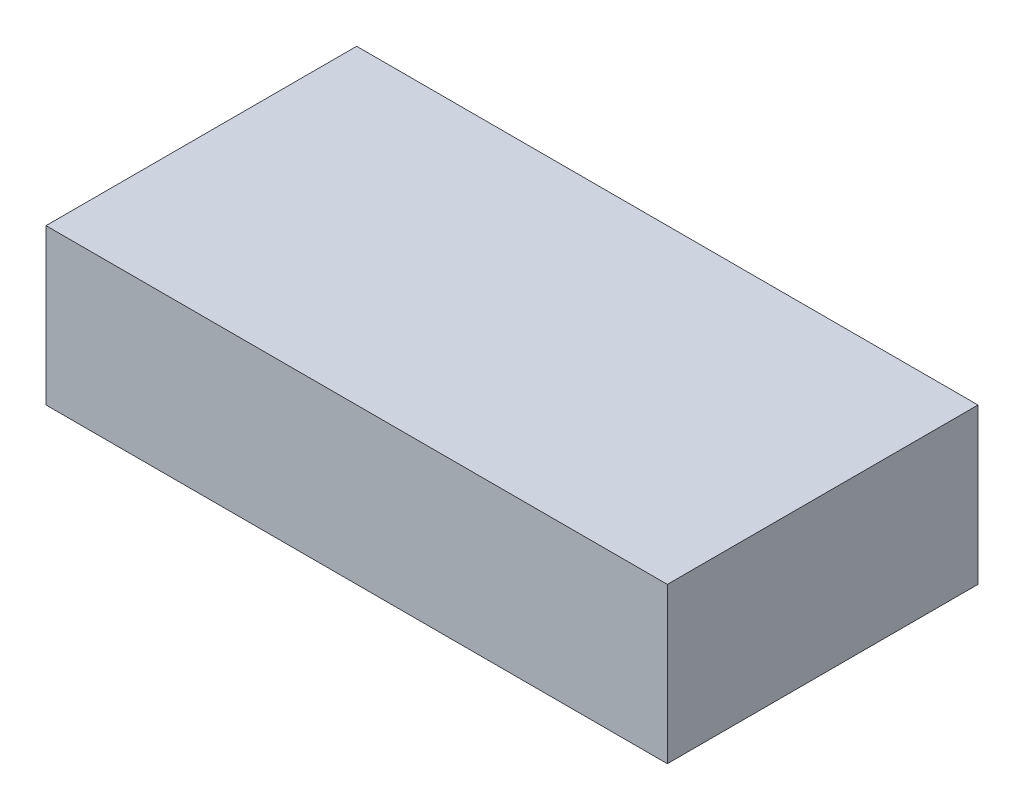
ISO-10303-21;
HEADER;
FILE_DESCRIPTION(('STEP AP214'),'2;1');
FILE_NAME('part.step','',(''),(''),'','','');
FILE_SCHEMA(('AUTOMOTIVE_DESIGN { 1 0 10303 214 1 1 1 1 }'));
ENDSEC;
DATA;
#1=APPLICATION_CONTEXT('core data for automotive mechanical design processes');
#2=APPLICATION_PROTOCOL_DEFINITION('international standard','automotive_design',2000,#1);
#3=PRODUCT_CONTEXT('',#1,'mechanical');
#4=PRODUCT('Part','Part','',(#3));
#5=PRODUCT_RELATED_PRODUCT_CATEGORY('part','',(#4));
#6=PRODUCT_DEFINITION_FORMATION('','',#4);
#7=PRODUCT_DEFINITION_CONTEXT('part definition',#1,'design');
#8=PRODUCT_DEFINITION('design','',#6,#7);
#9=PRODUCT_DEFINITION_SHAPE('','',#8);
#10=(LENGTH_UNIT() NAMED_UNIT(*) SI_UNIT(.MILLI.,.METRE.));
#11=(NAMED_UNIT(*) PLANE_ANGLE_UNIT() SI_UNIT($,.RADIAN.));
#12=(NAMED_UNIT(*) SI_UNIT($,.STERADIAN.) SOLID_ANGLE_UNIT());
#13=UNCERTAINTY_MEASURE_WITH_UNIT(LENGTH_MEASURE(1.E-05),#10,'distance_accuracy_value','');
#14=(GEOMETRIC_REPRESENTATION_CONTEXT(3) GLOBAL_UNCERTAINTY_ASSIGNED_CONTEXT((#13)) GLOBAL_UNIT_ASSIGNED_CONTEXT((#10,
#11,#12)) REPRESENTATION_CONTEXT('',''));
#15=CARTESIAN_POINT('',(0.,0.,0.));
#16=DIRECTION('',(0.,0.,1.));
#17=DIRECTION('',(1.,0.,0.));
#18=AXIS2_PLACEMENT_3D('',#15,#16,#17);
#19=CARTESIAN_POINT('',(-100.,50.,-50.));
#20=DIRECTION('',(1.,0.,0.));
#21=DIRECTION('',(0.,0.,-1.));
#22=AXIS2_PLACEMENT_3D('',#19,#20,#21);
#23=PLANE('',#22);
#24=DIRECTION('',(0.,0.,1.));
#25=VECTOR('',#24,1.);
#26=CARTESIAN_POINT('',(-100.,0.,-50.));
#27=LINE('',#26,#25);
#28=CARTESIAN_POINT('',(-100.,0.,-50.));
#29=VERTEX_POINT('',#28);
#30=CARTESIAN_POINT('',(-100.,0.,50.));
#31=VERTEX_POINT('',#30);
#32=EDGE_CURVE('E107',#29,#31,#27,.T.);
#33=ORIENTED_EDGE('',*,*,#32,.T.);
#34=DIRECTION('',(0.,-1.,0.));
#35=VECTOR('',#34,1.);
#36=CARTESIAN_POINT('',(-100.,50.,50.));
#37=LINE('',#36,#35);
#38=CARTESIAN_POINT('',(-100.,50.,50.));
#39=VERTEX_POINT('',#38);
#40=EDGE_CURVE('E11',#39,#31,#37,.T.);
#41=ORIENTED_EDGE('',*,*,#40,.F.);
#42=DIRECTION('',(0.,0.,1.));
#43=VECTOR('',#42,1.);
#44=CARTESIAN_POINT('',(-100.,50.,-50.));
#45=LINE('',#44,#43);
#46=CARTESIAN_POINT('',(-100.,50.,-50.));
#47=VERTEX_POINT('',#46);
#48=EDGE_CURVE('E91',#47,#39,#45,.T.);
#49=ORIENTED_EDGE('',*,*,#48,.F.);
#50=DIRECTION('',(0.,-1.,0.));
#51=VECTOR('',#50,1.);
#52=CARTESIAN_POINT('',(-100.,50.,-50.));
#53=LINE('',#52,#51);
#54=EDGE_CURVE('E103',#47,#29,#53,.T.);
#55=ORIENTED_EDGE('',*,*,#54,.T.);
#56=EDGE_LOOP('',(#33,#41,#49,#55));
#57=FACE_BOUND('',#56,.T.);
#58=ADVANCED_FACE('F39',(#57),#23,.F.);
#59=CARTESIAN_POINT('',(100.,50.,50.));
#60=DIRECTION('',(0.,0.,-1.));
#61=DIRECTION('',(-1.,0.,0.));
#62=AXIS2_PLACEMENT_3D('',#59,#60,#61);
#63=PLANE('',#62);
#64=DIRECTION('',(1.,0.,0.));
#65=VECTOR('',#64,1.);
#66=CARTESIAN_POINT('',(100.,0.,50.));
#67=LINE('',#66,#65);
#68=CARTESIAN_POINT('',(100.,0.,50.));
#69=VERTEX_POINT('',#68);
#70=EDGE_CURVE('E96',#31,#69,#67,.T.);
#71=ORIENTED_EDGE('',*,*,#70,.T.);
#72=DIRECTION('',(0.,-1.,0.));
#73=VECTOR('',#72,1.);
#74=CARTESIAN_POINT('',(100.,50.,50.));
#75=LINE('',#74,#73);
#76=CARTESIAN_POINT('',(100.,50.,50.));
#77=VERTEX_POINT('',#76);
#78=EDGE_CURVE('E48',#77,#69,#75,.T.);
#79=ORIENTED_EDGE('',*,*,#78,.F.);
#80=DIRECTION('',(1.,0.,0.));
#81=VECTOR('',#80,1.);
#82=CARTESIAN_POINT('',(100.,50.,50.));
#83=LINE('',#82,#81);
#84=EDGE_CURVE('E86',#39,#77,#83,.T.);
#85=ORIENTED_EDGE('',*,*,#84,.F.);
#86=ORIENTED_EDGE('',*,*,#40,.T.);
#87=EDGE_LOOP('',(#71,#79,#85,#86));
#88=FACE_BOUND('',#87,.T.);
#89=ADVANCED_FACE('F95',(#88),#63,.F.);
#90=CARTESIAN_POINT('',(100.,50.,-50.));
#91=DIRECTION('',(-1.,0.,0.));
#92=DIRECTION('',(0.,0.,1.));
#93=AXIS2_PLACEMENT_3D('',#90,#91,#92);
#94=PLANE('',#93);
#95=DIRECTION('',(0.,0.,-1.));
#96=VECTOR('',#95,1.);
#97=CARTESIAN_POINT('',(100.,0.,-50.));
#98=LINE('',#97,#96);
#99=CARTESIAN_POINT('',(100.,0.,-50.));
#100=VERTEX_POINT('',#99);
#101=EDGE_CURVE('E73',#69,#100,#98,.T.);
#102=ORIENTED_EDGE('',*,*,#101,.T.);
#103=DIRECTION('',(0.,-1.,0.));
#104=VECTOR('',#103,1.);
#105=CARTESIAN_POINT('',(100.,50.,-50.));
#106=LINE('',#105,#104);
#107=CARTESIAN_POINT('',(100.,50.,-50.));
#108=VERTEX_POINT('',#107);
#109=EDGE_CURVE('E98',#108,#100,#106,.T.);
#110=ORIENTED_EDGE('',*,*,#109,.F.);
#111=DIRECTION('',(0.,0.,-1.));
#112=VECTOR('',#111,1.);
#113=CARTESIAN_POINT('',(100.,50.,-50.));
#114=LINE('',#113,#112);
#115=EDGE_CURVE('E89',#77,#108,#114,.T.);
#116=ORIENTED_EDGE('',*,*,#115,.F.);
#117=ORIENTED_EDGE('',*,*,#78,.T.);
#118=EDGE_LOOP('',(#102,#110,#116,#117));
#119=FACE_BOUND('',#118,.T.);
#120=ADVANCED_FACE('F99',(#119),#94,.F.);
#121=CARTESIAN_POINT('',(100.,50.,-50.));
#122=DIRECTION('',(0.,0.,1.));
#123=DIRECTION('',(1.,0.,0.));
#124=AXIS2_PLACEMENT_3D('',#121,#122,#123);
#125=PLANE('',#124);
#126=DIRECTION('',(-1.,0.,0.));
#127=VECTOR('',#126,1.);
#128=CARTESIAN_POINT('',(100.,0.,-50.));
#129=LINE('',#128,#127);
#130=EDGE_CURVE('E79',#100,#29,#129,.T.);
#131=ORIENTED_EDGE('',*,*,#130,.T.);
#132=ORIENTED_EDGE('',*,*,#54,.F.);
#133=DIRECTION('',(-1.,0.,0.));
#134=VECTOR('',#133,1.);
#135=CARTESIAN_POINT('',(100.,50.,-50.));
#136=LINE('',#135,#134);
#137=EDGE_CURVE('E56',#108,#47,#136,.T.);
#138=ORIENTED_EDGE('',*,*,#137,.F.);
#139=ORIENTED_EDGE('',*,*,#109,.T.);
#140=EDGE_LOOP('',(#131,#132,#138,#139));
#141=FACE_BOUND('',#140,.T.);
#142=ADVANCED_FACE('F120',(#141),#125,.F.);
#143=CARTESIAN_POINT('',(0.,50.,0.));
#144=DIRECTION('',(0.,-1.,0.));
#145=DIRECTION('',(0.,0.,-1.));
#146=AXIS2_PLACEMENT_3D('',#143,#144,#145);
#147=PLANE('',#146);
#148=ORIENTED_EDGE('',*,*,#48,.T.);
#149=ORIENTED_EDGE('',*,*,#84,.T.);
#150=ORIENTED_EDGE('',*,*,#115,.T.);
#151=ORIENTED_EDGE('',*,*,#137,.T.);
#152=EDGE_LOOP('',(#148,#149,#150,#151));
#153=FACE_BOUND('',#152,.T.);
#154=ADVANCED_FACE('F87',(#153),#147,.F.);
#155=CARTESIAN_POINT('',(0.,0.,0.));
#156=DIRECTION('',(0.,-1.,0.));
#157=DIRECTION('',(0.,0.,-1.));
#158=AXIS2_PLACEMENT_3D('',#155,#156,#157);
#159=PLANE('',#158);
#160=ORIENTED_EDGE('',*,*,#32,.F.);
#161=ORIENTED_EDGE('',*,*,#130,.F.);
#162=ORIENTED_EDGE('',*,*,#101,.F.);
#163=ORIENTED_EDGE('',*,*,#70,.F.);
#164=EDGE_LOOP('',(#160,#161,#162,#163));
#165=FACE_BOUND('',#164,.T.);
#166=ADVANCED_FACE('F123',(#165),#159,.T.);
#167=CLOSED_SHELL('',(#58,#89,#120,#142,#154,#166));
#168=MANIFOLD_SOLID_BREP('B2',#167);
#169=ADVANCED_BREP_SHAPE_REPRESENTATION('',(#18,#168),#14);
#170=SHAPE_DEFINITION_REPRESENTATION(#9,#169);
ENDSEC;
END-ISO-10303-21;
